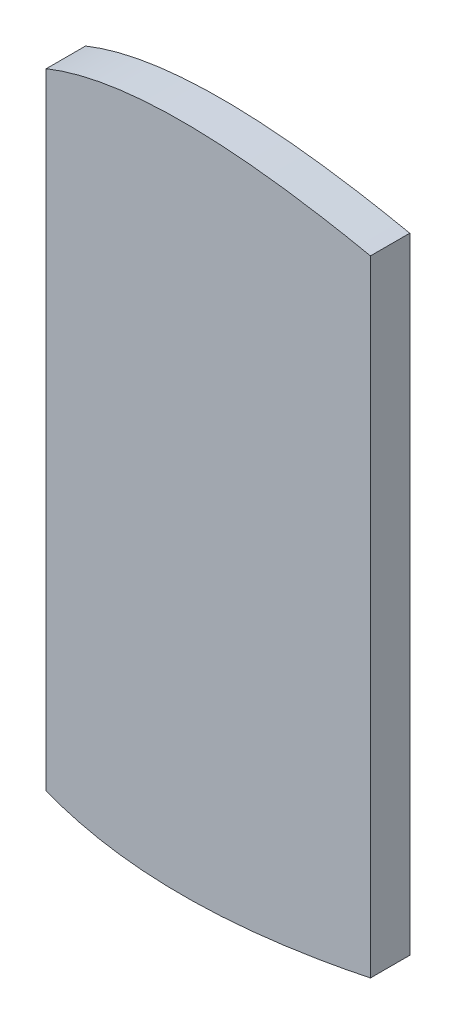
ISO-10303-21;
HEADER;
FILE_DESCRIPTION(('STEP AP214'),'2;1');
FILE_NAME('part.step','',(''),(''),'','','');
FILE_SCHEMA(('AUTOMOTIVE_DESIGN { 1 0 10303 214 1 1 1 1 }'));
ENDSEC;
DATA;
#1=APPLICATION_CONTEXT('core data for automotive mechanical design processes');
#2=APPLICATION_PROTOCOL_DEFINITION('international standard','automotive_design',2000,#1);
#3=PRODUCT_CONTEXT('',#1,'mechanical');
#4=PRODUCT('Part','Part','',(#3));
#5=PRODUCT_RELATED_PRODUCT_CATEGORY('part','',(#4));
#6=PRODUCT_DEFINITION_FORMATION('','',#4);
#7=PRODUCT_DEFINITION_CONTEXT('part definition',#1,'design');
#8=PRODUCT_DEFINITION('design','',#6,#7);
#9=PRODUCT_DEFINITION_SHAPE('','',#8);
#10=(LENGTH_UNIT() NAMED_UNIT(*) SI_UNIT(.MILLI.,.METRE.));
#11=(NAMED_UNIT(*) PLANE_ANGLE_UNIT() SI_UNIT($,.RADIAN.));
#12=(NAMED_UNIT(*) SI_UNIT($,.STERADIAN.) SOLID_ANGLE_UNIT());
#13=UNCERTAINTY_MEASURE_WITH_UNIT(LENGTH_MEASURE(1.E-05),#10,'distance_accuracy_value','');
#14=(GEOMETRIC_REPRESENTATION_CONTEXT(3) GLOBAL_UNCERTAINTY_ASSIGNED_CONTEXT((#13)) GLOBAL_UNIT_ASSIGNED_CONTEXT((#10,
#11,#12)) REPRESENTATION_CONTEXT('',''));
#15=CARTESIAN_POINT('',(0.,0.,0.));
#16=DIRECTION('',(0.,0.,1.));
#17=DIRECTION('',(1.,0.,0.));
#18=AXIS2_PLACEMENT_3D('',#15,#16,#17);
#19=CARTESIAN_POINT('',(37.8955125,48.,8.8));
#20=CARTESIAN_POINT('',(62.6455125,58.,8.8));
#21=CARTESIAN_POINT('',(110.4755125,48.,8.8));
#22=B_SPLINE_CURVE_WITH_KNOTS('',2,(#19,#20,#21),.UNSPECIFIED.,.F.,.F.,(3,3),(0.,1.),.UNSPECIFIED.);
#23=DIRECTION('',(0.,0.,-1.));
#24=VECTOR('',#23,1.);
#25=SURFACE_OF_LINEAR_EXTRUSION('',#22,#24);
#26=CARTESIAN_POINT('',(37.8955125,48.,0.));
#27=CARTESIAN_POINT('',(62.6455125,58.,0.));
#28=CARTESIAN_POINT('',(110.4755125,48.,0.));
#29=B_SPLINE_CURVE_WITH_KNOTS('',2,(#26,#27,#28),.UNSPECIFIED.,.F.,.F.,(3,3),(0.,1.),.UNSPECIFIED.);
#30=CARTESIAN_POINT('',(37.8955125,48.,0.));
#31=VERTEX_POINT('',#30);
#32=CARTESIAN_POINT('',(110.4755125,48.,0.));
#33=VERTEX_POINT('',#32);
#34=EDGE_CURVE('E137',#31,#33,#29,.T.);
#35=ORIENTED_EDGE('',*,*,#34,.F.);
#36=DIRECTION('',(0.,0.,-1.));
#37=VECTOR('',#36,1.);
#38=CARTESIAN_POINT('',(37.8955125,48.,8.8));
#39=LINE('',#38,#37);
#40=CARTESIAN_POINT('',(37.8955125,48.,8.8));
#41=VERTEX_POINT('',#40);
#42=EDGE_CURVE('E11',#41,#31,#39,.T.);
#43=ORIENTED_EDGE('',*,*,#42,.F.);
#44=CARTESIAN_POINT('',(110.4755125,48.,8.8));
#45=VERTEX_POINT('',#44);
#46=EDGE_CURVE('E109',#41,#45,#22,.T.);
#47=ORIENTED_EDGE('',*,*,#46,.T.);
#48=DIRECTION('',(0.,0.,-1.));
#49=VECTOR('',#48,1.);
#50=CARTESIAN_POINT('',(110.4755125,48.,8.8));
#51=LINE('',#50,#49);
#52=EDGE_CURVE('E65',#45,#33,#51,.T.);
#53=ORIENTED_EDGE('',*,*,#52,.T.);
#54=EDGE_LOOP('',(#35,#43,#47,#53));
#55=FACE_BOUND('',#54,.T.);
#56=ADVANCED_FACE('F47',(#55),#25,.T.);
#57=CARTESIAN_POINT('',(37.8955125,0.,8.8));
#58=DIRECTION('',(-1.,0.,0.));
#59=DIRECTION('',(0.,-1.,0.));
#60=AXIS2_PLACEMENT_3D('',#57,#58,#59);
#61=PLANE('',#60);
#62=DIRECTION('',(0.,1.,0.));
#63=VECTOR('',#62,1.);
#64=CARTESIAN_POINT('',(37.8955125,0.,0.));
#65=LINE('',#64,#63);
#66=CARTESIAN_POINT('',(37.8955125,-92.,0.));
#67=VERTEX_POINT('',#66);
#68=EDGE_CURVE('E97',#67,#31,#65,.T.);
#69=ORIENTED_EDGE('',*,*,#68,.F.);
#70=DIRECTION('',(0.,0.,-1.));
#71=VECTOR('',#70,1.);
#72=CARTESIAN_POINT('',(37.8955125,-92.,8.8));
#73=LINE('',#72,#71);
#74=CARTESIAN_POINT('',(37.8955125,-92.,8.8));
#75=VERTEX_POINT('',#74);
#76=EDGE_CURVE('E57',#75,#67,#73,.T.);
#77=ORIENTED_EDGE('',*,*,#76,.F.);
#78=DIRECTION('',(0.,1.,0.));
#79=VECTOR('',#78,1.);
#80=CARTESIAN_POINT('',(37.8955125,0.,8.8));
#81=LINE('',#80,#79);
#82=EDGE_CURVE('E95',#75,#41,#81,.T.);
#83=ORIENTED_EDGE('',*,*,#82,.T.);
#84=ORIENTED_EDGE('',*,*,#42,.T.);
#85=EDGE_LOOP('',(#69,#77,#83,#84));
#86=FACE_BOUND('',#85,.T.);
#87=ADVANCED_FACE('F93',(#86),#61,.T.);
#88=CARTESIAN_POINT('',(37.8955125,-92.,8.8));
#89=CARTESIAN_POINT('',(62.6455125,-102.,8.8));
#90=CARTESIAN_POINT('',(110.4755125,-92.,8.8));
#91=B_SPLINE_CURVE_WITH_KNOTS('',2,(#88,#89,#90),.UNSPECIFIED.,.F.,.F.,(3,3),(0.,1.),.UNSPECIFIED.);
#92=DIRECTION('',(0.,0.,-1.));
#93=VECTOR('',#92,1.);
#94=SURFACE_OF_LINEAR_EXTRUSION('',#91,#93);
#95=CARTESIAN_POINT('',(37.8955125,-92.,0.));
#96=CARTESIAN_POINT('',(62.6455125,-102.,0.));
#97=CARTESIAN_POINT('',(110.4755125,-92.,0.));
#98=B_SPLINE_CURVE_WITH_KNOTS('',2,(#95,#96,#97),.UNSPECIFIED.,.F.,.F.,(3,3),(0.,1.),.UNSPECIFIED.);
#99=CARTESIAN_POINT('',(110.4755125,-92.,0.));
#100=VERTEX_POINT('',#99);
#101=EDGE_CURVE('E142',#67,#100,#98,.T.);
#102=ORIENTED_EDGE('',*,*,#101,.T.);
#103=DIRECTION('',(0.,0.,-1.));
#104=VECTOR('',#103,1.);
#105=CARTESIAN_POINT('',(110.4755125,-92.,8.8));
#106=LINE('',#105,#104);
#107=CARTESIAN_POINT('',(110.4755125,-92.,8.8));
#108=VERTEX_POINT('',#107);
#109=EDGE_CURVE('E79',#108,#100,#106,.T.);
#110=ORIENTED_EDGE('',*,*,#109,.F.);
#111=EDGE_CURVE('E101',#75,#108,#91,.T.);
#112=ORIENTED_EDGE('',*,*,#111,.F.);
#113=ORIENTED_EDGE('',*,*,#76,.T.);
#114=EDGE_LOOP('',(#102,#110,#112,#113));
#115=FACE_BOUND('',#114,.T.);
#116=ADVANCED_FACE('F102',(#115),#94,.F.);
#117=CARTESIAN_POINT('',(110.4755125,0.,8.8));
#118=DIRECTION('',(1.,0.,0.));
#119=DIRECTION('',(0.,0.,-1.));
#120=AXIS2_PLACEMENT_3D('',#117,#118,#119);
#121=PLANE('',#120);
#122=DIRECTION('',(0.,-1.,0.));
#123=VECTOR('',#122,1.);
#124=CARTESIAN_POINT('',(110.4755125,0.,0.));
#125=LINE('',#124,#123);
#126=EDGE_CURVE('E114',#33,#100,#125,.T.);
#127=ORIENTED_EDGE('',*,*,#126,.F.);
#128=ORIENTED_EDGE('',*,*,#52,.F.);
#129=DIRECTION('',(0.,-1.,0.));
#130=VECTOR('',#129,1.);
#131=CARTESIAN_POINT('',(110.4755125,0.,8.8));
#132=LINE('',#131,#130);
#133=EDGE_CURVE('E106',#45,#108,#132,.T.);
#134=ORIENTED_EDGE('',*,*,#133,.T.);
#135=ORIENTED_EDGE('',*,*,#109,.T.);
#136=EDGE_LOOP('',(#127,#128,#134,#135));
#137=FACE_BOUND('',#136,.T.);
#138=ADVANCED_FACE('F129',(#137),#121,.T.);
#139=CARTESIAN_POINT('',(0.,0.,8.8));
#140=DIRECTION('',(0.,0.,1.));
#141=DIRECTION('',(1.,0.,0.));
#142=AXIS2_PLACEMENT_3D('',#139,#140,#141);
#143=PLANE('',#142);
#144=ORIENTED_EDGE('',*,*,#46,.F.);
#145=ORIENTED_EDGE('',*,*,#82,.F.);
#146=ORIENTED_EDGE('',*,*,#111,.T.);
#147=ORIENTED_EDGE('',*,*,#133,.F.);
#148=EDGE_LOOP('',(#144,#145,#146,#147));
#149=FACE_BOUND('',#148,.T.);
#150=ADVANCED_FACE('F108',(#149),#143,.T.);
#151=CARTESIAN_POINT('',(0.,0.,0.));
#152=DIRECTION('',(0.,0.,1.));
#153=DIRECTION('',(1.,0.,0.));
#154=AXIS2_PLACEMENT_3D('',#151,#152,#153);
#155=PLANE('',#154);
#156=ORIENTED_EDGE('',*,*,#34,.T.);
#157=ORIENTED_EDGE('',*,*,#126,.T.);
#158=ORIENTED_EDGE('',*,*,#101,.F.);
#159=ORIENTED_EDGE('',*,*,#68,.T.);
#160=EDGE_LOOP('',(#156,#157,#158,#159));
#161=FACE_BOUND('',#160,.T.);
#162=ADVANCED_FACE('F141',(#161),#155,.F.);
#163=CLOSED_SHELL('',(#56,#87,#116,#138,#150,#162));
#164=MANIFOLD_SOLID_BREP('B2',#163);
#165=ADVANCED_BREP_SHAPE_REPRESENTATION('',(#18,#164),#14);
#166=SHAPE_DEFINITION_REPRESENTATION(#9,#165);
ENDSEC;
END-ISO-10303-21;
